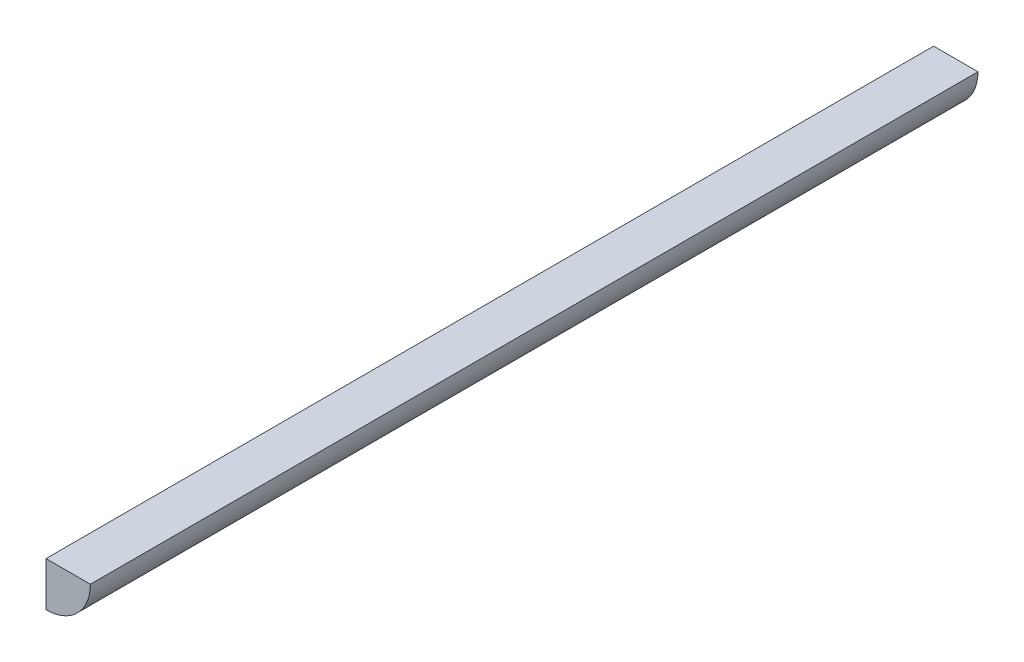
ISO-10303-21;
HEADER;
FILE_DESCRIPTION(('STEP AP214'),'2;1');
FILE_NAME('part.step','',(''),(''),'','','');
FILE_SCHEMA(('AUTOMOTIVE_DESIGN { 1 0 10303 214 1 1 1 1 }'));
ENDSEC;
DATA;
#1=APPLICATION_CONTEXT('core data for automotive mechanical design processes');
#2=APPLICATION_PROTOCOL_DEFINITION('international standard','automotive_design',2000,#1);
#3=PRODUCT_CONTEXT('',#1,'mechanical');
#4=PRODUCT('Part','Part','',(#3));
#5=PRODUCT_RELATED_PRODUCT_CATEGORY('part','',(#4));
#6=PRODUCT_DEFINITION_FORMATION('','',#4);
#7=PRODUCT_DEFINITION_CONTEXT('part definition',#1,'design');
#8=PRODUCT_DEFINITION('design','',#6,#7);
#9=PRODUCT_DEFINITION_SHAPE('','',#8);
#10=(LENGTH_UNIT() NAMED_UNIT(*) SI_UNIT(.MILLI.,.METRE.));
#11=(NAMED_UNIT(*) PLANE_ANGLE_UNIT() SI_UNIT($,.RADIAN.));
#12=(NAMED_UNIT(*) SI_UNIT($,.STERADIAN.) SOLID_ANGLE_UNIT());
#13=UNCERTAINTY_MEASURE_WITH_UNIT(LENGTH_MEASURE(1.E-05),#10,'distance_accuracy_value','');
#14=(GEOMETRIC_REPRESENTATION_CONTEXT(3) GLOBAL_UNCERTAINTY_ASSIGNED_CONTEXT((#13)) GLOBAL_UNIT_ASSIGNED_CONTEXT((#10,
#11,#12)) REPRESENTATION_CONTEXT('',''));
#15=CARTESIAN_POINT('',(0.,0.,0.));
#16=DIRECTION('',(0.,0.,1.));
#17=DIRECTION('',(1.,0.,0.));
#18=AXIS2_PLACEMENT_3D('',#15,#16,#17);
#19=CARTESIAN_POINT('',(0.,-20.,200.));
#20=DIRECTION('',(1.,0.,0.));
#21=DIRECTION('',(0.,1.,0.));
#22=AXIS2_PLACEMENT_3D('',#19,#20,#21);
#23=PLANE('',#22);
#24=DIRECTION('',(0.,-1.,0.));
#25=VECTOR('',#24,1.);
#26=CARTESIAN_POINT('',(0.,-20.,-200.));
#27=LINE('',#26,#25);
#28=CARTESIAN_POINT('',(0.,0.,-200.));
#29=VERTEX_POINT('',#28);
#30=CARTESIAN_POINT('',(0.,-20.,-200.));
#31=VERTEX_POINT('',#30);
#32=EDGE_CURVE('E100',#29,#31,#27,.T.);
#33=ORIENTED_EDGE('',*,*,#32,.T.);
#34=DIRECTION('',(0.,0.,-1.));
#35=VECTOR('',#34,1.);
#36=CARTESIAN_POINT('',(0.,-20.,200.));
#37=LINE('',#36,#35);
#38=CARTESIAN_POINT('',(0.,-20.,200.));
#39=VERTEX_POINT('',#38);
#40=EDGE_CURVE('E11',#39,#31,#37,.T.);
#41=ORIENTED_EDGE('',*,*,#40,.F.);
#42=DIRECTION('',(0.,-1.,0.));
#43=VECTOR('',#42,1.);
#44=CARTESIAN_POINT('',(0.,-20.,200.));
#45=LINE('',#44,#43);
#46=CARTESIAN_POINT('',(0.,0.,200.));
#47=VERTEX_POINT('',#46);
#48=EDGE_CURVE('E93',#47,#39,#45,.T.);
#49=ORIENTED_EDGE('',*,*,#48,.F.);
#50=DIRECTION('',(0.,0.,-1.));
#51=VECTOR('',#50,1.);
#52=CARTESIAN_POINT('',(0.,0.,200.));
#53=LINE('',#52,#51);
#54=EDGE_CURVE('E101',#47,#29,#53,.T.);
#55=ORIENTED_EDGE('',*,*,#54,.T.);
#56=EDGE_LOOP('',(#33,#41,#49,#55));
#57=FACE_BOUND('',#56,.T.);
#58=ADVANCED_FACE('F49',(#57),#23,.F.);
#59=CARTESIAN_POINT('',(0.,0.,200.));
#60=DIRECTION('',(0.,0.,-1.));
#61=DIRECTION('',(-1.,0.,0.));
#62=AXIS2_PLACEMENT_3D('',#59,#60,#61);
#63=CYLINDRICAL_SURFACE('',#62,20.);
#64=CARTESIAN_POINT('',(0.,0.,-200.));
#65=DIRECTION('',(0.,0.,1.));
#66=DIRECTION('',(-1.,0.,0.));
#67=AXIS2_PLACEMENT_3D('',#64,#65,#66);
#68=CIRCLE('',#67,20.);
#69=CARTESIAN_POINT('',(20.,0.,-200.));
#70=VERTEX_POINT('',#69);
#71=EDGE_CURVE('E81',#31,#70,#68,.T.);
#72=ORIENTED_EDGE('',*,*,#71,.T.);
#73=DIRECTION('',(0.,0.,-1.));
#74=VECTOR('',#73,1.);
#75=CARTESIAN_POINT('',(20.,0.,200.));
#76=LINE('',#75,#74);
#77=CARTESIAN_POINT('',(20.,0.,200.));
#78=VERTEX_POINT('',#77);
#79=EDGE_CURVE('E58',#78,#70,#76,.T.);
#80=ORIENTED_EDGE('',*,*,#79,.F.);
#81=CARTESIAN_POINT('',(0.,0.,200.));
#82=DIRECTION('',(0.,0.,1.));
#83=DIRECTION('',(-1.,0.,0.));
#84=AXIS2_PLACEMENT_3D('',#81,#82,#83);
#85=CIRCLE('',#84,20.);
#86=EDGE_CURVE('E89',#39,#78,#85,.T.);
#87=ORIENTED_EDGE('',*,*,#86,.F.);
#88=ORIENTED_EDGE('',*,*,#40,.T.);
#89=EDGE_LOOP('',(#72,#80,#87,#88));
#90=FACE_BOUND('',#89,.T.);
#91=ADVANCED_FACE('F90',(#90),#63,.T.);
#92=CARTESIAN_POINT('',(0.,0.,200.));
#93=DIRECTION('',(0.,-1.,0.));
#94=DIRECTION('',(0.,0.,-1.));
#95=AXIS2_PLACEMENT_3D('',#92,#93,#94);
#96=PLANE('',#95);
#97=DIRECTION('',(-1.,0.,0.));
#98=VECTOR('',#97,1.);
#99=CARTESIAN_POINT('',(0.,0.,-200.));
#100=LINE('',#99,#98);
#101=EDGE_CURVE('E86',#70,#29,#100,.T.);
#102=ORIENTED_EDGE('',*,*,#101,.T.);
#103=ORIENTED_EDGE('',*,*,#54,.F.);
#104=DIRECTION('',(-1.,0.,0.));
#105=VECTOR('',#104,1.);
#106=CARTESIAN_POINT('',(0.,0.,200.));
#107=LINE('',#106,#105);
#108=EDGE_CURVE('E66',#78,#47,#107,.T.);
#109=ORIENTED_EDGE('',*,*,#108,.F.);
#110=ORIENTED_EDGE('',*,*,#79,.T.);
#111=EDGE_LOOP('',(#102,#103,#109,#110));
#112=FACE_BOUND('',#111,.T.);
#113=ADVANCED_FACE('F113',(#112),#96,.F.);
#114=CARTESIAN_POINT('',(0.,0.,200.));
#115=DIRECTION('',(0.,0.,-1.));
#116=DIRECTION('',(-1.,0.,0.));
#117=AXIS2_PLACEMENT_3D('',#114,#115,#116);
#118=PLANE('',#117);
#119=ORIENTED_EDGE('',*,*,#48,.T.);
#120=ORIENTED_EDGE('',*,*,#86,.T.);
#121=ORIENTED_EDGE('',*,*,#108,.T.);
#122=EDGE_LOOP('',(#119,#120,#121));
#123=FACE_BOUND('',#122,.T.);
#124=ADVANCED_FACE('F96',(#123),#118,.F.);
#125=CARTESIAN_POINT('',(0.,0.,-200.));
#126=DIRECTION('',(0.,0.,-1.));
#127=DIRECTION('',(-1.,0.,0.));
#128=AXIS2_PLACEMENT_3D('',#125,#126,#127);
#129=PLANE('',#128);
#130=ORIENTED_EDGE('',*,*,#32,.F.);
#131=ORIENTED_EDGE('',*,*,#101,.F.);
#132=ORIENTED_EDGE('',*,*,#71,.F.);
#133=EDGE_LOOP('',(#130,#131,#132));
#134=FACE_BOUND('',#133,.T.);
#135=ADVANCED_FACE('F114',(#134),#129,.T.);
#136=CLOSED_SHELL('',(#58,#91,#113,#124,#135));
#137=MANIFOLD_SOLID_BREP('B2',#136);
#138=ADVANCED_BREP_SHAPE_REPRESENTATION('',(#18,#137),#14);
#139=SHAPE_DEFINITION_REPRESENTATION(#9,#138);
ENDSEC;
END-ISO-10303-21;
